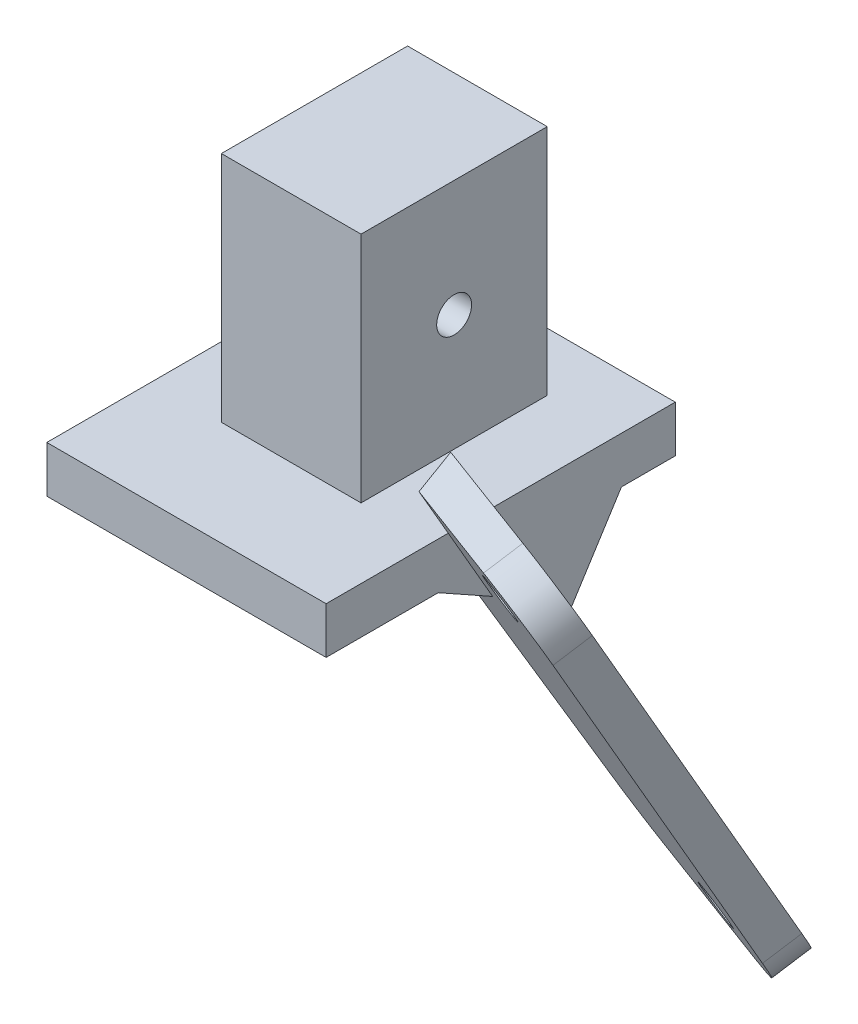
ISO-10303-21;
HEADER;
FILE_DESCRIPTION(('STEP AP214'),'2;1');
FILE_NAME('part.step','',(''),(''),'','','');
FILE_SCHEMA(('AUTOMOTIVE_DESIGN { 1 0 10303 214 1 1 1 1 }'));
ENDSEC;
DATA;
#1=APPLICATION_CONTEXT('core data for automotive mechanical design processes');
#2=APPLICATION_PROTOCOL_DEFINITION('international standard','automotive_design',2000,#1);
#3=PRODUCT_CONTEXT('',#1,'mechanical');
#4=PRODUCT('Part','Part','',(#3));
#5=PRODUCT_RELATED_PRODUCT_CATEGORY('part','',(#4));
#6=PRODUCT_DEFINITION_FORMATION('','',#4);
#7=PRODUCT_DEFINITION_CONTEXT('part definition',#1,'design');
#8=PRODUCT_DEFINITION('design','',#6,#7);
#9=PRODUCT_DEFINITION_SHAPE('','',#8);
#10=(LENGTH_UNIT() NAMED_UNIT(*) SI_UNIT(.MILLI.,.METRE.));
#11=(NAMED_UNIT(*) PLANE_ANGLE_UNIT() SI_UNIT($,.RADIAN.));
#12=(NAMED_UNIT(*) SI_UNIT($,.STERADIAN.) SOLID_ANGLE_UNIT());
#13=UNCERTAINTY_MEASURE_WITH_UNIT(LENGTH_MEASURE(1.E-05),#10,'distance_accuracy_value','');
#14=(GEOMETRIC_REPRESENTATION_CONTEXT(3) GLOBAL_UNCERTAINTY_ASSIGNED_CONTEXT((#13)) GLOBAL_UNIT_ASSIGNED_CONTEXT((#10,
#11,#12)) REPRESENTATION_CONTEXT('',''));
#15=CARTESIAN_POINT('',(0.,0.,0.));
#16=DIRECTION('',(0.,0.,1.));
#17=DIRECTION('',(1.,0.,0.));
#18=AXIS2_PLACEMENT_3D('',#15,#16,#17);
#19=CARTESIAN_POINT('',(0.,0.,0.));
#20=DIRECTION('',(0.,1.,0.));
#21=DIRECTION('',(0.,0.,1.));
#22=AXIS2_PLACEMENT_3D('',#19,#20,#21);
#23=PLANE('',#22);
#24=DIRECTION('',(0.,0.,-1.));
#25=VECTOR('',#24,1.);
#26=CARTESIAN_POINT('',(24.,0.,0.));
#27=LINE('',#26,#25);
#28=CARTESIAN_POINT('',(24.,0.,4.62668487913654));
#29=VERTEX_POINT('',#28);
#30=CARTESIAN_POINT('',(24.,0.,0.));
#31=VERTEX_POINT('',#30);
#32=EDGE_CURVE('E329',#29,#31,#27,.T.);
#33=ORIENTED_EDGE('',*,*,#32,.F.);
#34=DIRECTION('',(-0.939692620785907,0.,-0.342020143325673));
#35=VECTOR('',#34,1.);
#36=CARTESIAN_POINT('',(10.486715336839,0.,-0.291748505420117));
#37=LINE('',#36,#35);
#38=CARTESIAN_POINT('',(11.2882877676404,0.,0.));
#39=VERTEX_POINT('',#38);
#40=EDGE_CURVE('E520',#29,#39,#37,.T.);
#41=ORIENTED_EDGE('',*,*,#40,.T.);
#42=DIRECTION('',(-1.,0.,0.));
#43=VECTOR('',#42,1.);
#44=CARTESIAN_POINT('',(0.,0.,0.));
#45=LINE('',#44,#43);
#46=EDGE_CURVE('E321',#31,#39,#45,.T.);
#47=ORIENTED_EDGE('',*,*,#46,.F.);
#48=EDGE_LOOP('',(#33,#41,#47));
#49=FACE_BOUND('',#48,.T.);
#50=ADVANCED_FACE('F61',(#49),#23,.F.);
#51=CARTESIAN_POINT('',(24.9018797354497,9.78209952844714,19.5429186044547));
#52=DIRECTION('',(0.,-0.866025403784436,-0.500000000000004));
#53=DIRECTION('',(0.,0.500000000000004,-0.866025403784436));
#54=AXIS2_PLACEMENT_3D('',#51,#52,#53);
#55=PLANE('',#54);
#56=DIRECTION('',(0.953741925422946,-0.150313289241614,0.260350254019269));
#57=VECTOR('',#56,1.);
#58=CARTESIAN_POINT('',(24.,8.3514866403127,22.0208128126663));
#59=LINE('',#58,#57);
#60=CARTESIAN_POINT('',(24.,8.3514866403127,22.0208128126663));
#61=VERTEX_POINT('',#60);
#62=CARTESIAN_POINT('',(31.6299354033836,7.14898032637979,24.1036148448205));
#63=VERTEX_POINT('',#62);
#64=EDGE_CURVE('E263',#61,#63,#59,.T.);
#65=ORIENTED_EDGE('',*,*,#64,.T.);
#66=DIRECTION('',(-0.300626578483225,-0.476870962711477,0.825964736070553));
#67=VECTOR('',#66,1.);
#68=CARTESIAN_POINT('',(32.5318151388333,8.57959321451423,21.6257206366088));
#69=LINE('',#68,#67);
#70=CARTESIAN_POINT('',(32.5318151388333,8.57959321451423,21.6257206366088));
#71=VERTEX_POINT('',#70);
#72=EDGE_CURVE('E560',#63,#71,#69,.F.);
#73=ORIENTED_EDGE('',*,*,#72,.T.);
#74=DIRECTION('',(0.953741925422946,-0.150313289241614,0.260350254019269));
#75=VECTOR('',#74,1.);
#76=CARTESIAN_POINT('',(24.9018797354497,9.78209952844714,19.5429186044547));
#77=LINE('',#76,#75);
#78=CARTESIAN_POINT('',(24.,9.92423914286713,19.296725570511));
#79=VERTEX_POINT('',#78);
#80=EDGE_CURVE('E594',#79,#71,#77,.T.);
#81=ORIENTED_EDGE('',*,*,#80,.F.);
#82=DIRECTION('',(0.,0.500000000000004,-0.866025403784436));
#83=VECTOR('',#82,1.);
#84=CARTESIAN_POINT('',(24.,9.78209952844714,19.5429186044547));
#85=LINE('',#84,#83);
#86=EDGE_CURVE('E255',#61,#79,#85,.T.);
#87=ORIENTED_EDGE('',*,*,#86,.F.);
#88=EDGE_LOOP('',(#65,#73,#81,#87));
#89=FACE_BOUND('',#88,.T.);
#90=ADVANCED_FACE('F632',(#89),#55,.F.);
#91=CARTESIAN_POINT('',(-1.19973919209316,-1.9030944849345,3.29625633951065));
#92=DIRECTION('',(-0.300626578483225,-0.476870962711477,0.825964736070553));
#93=DIRECTION('',(0.,-0.866025403784436,-0.500000000000004));
#94=AXIS2_PLACEMENT_3D('',#91,#92,#93);
#95=PLANE('',#94);
#96=CARTESIAN_POINT('',(31.1012022506988,4.47493612945446,18.7351952555799));
#97=DIRECTION('',(-0.300626578483225,-0.476870962711477,0.825964736070553));
#98=DIRECTION('',(0.,-0.866025403784436,-0.500000000000004));
#99=AXIS2_PLACEMENT_3D('',#96,#97,#98);
#100=CIRCLE('',#99,1.8);
#101=CARTESIAN_POINT('',(31.1012022506988,2.91609040264248,17.8351952555799));
#102=VERTEX_POINT('',#101);
#103=EDGE_CURVE('E579',#102,#102,#100,.T.);
#104=ORIENTED_EDGE('',*,*,#103,.T.);
#105=EDGE_LOOP('',(#104));
#106=FACE_BOUND('',#105,.T.);
#107=CARTESIAN_POINT('',(31.1012022506988,-27.5680038105697,0.235195255579716));
#108=DIRECTION('',(-0.300626578483225,-0.476870962711477,0.825964736070553));
#109=DIRECTION('',(0.,-0.866025403784436,-0.500000000000004));
#110=AXIS2_PLACEMENT_3D('',#107,#108,#109);
#111=CIRCLE('',#110,1.8);
#112=CARTESIAN_POINT('',(31.1012022506988,-29.1268495373817,-0.664804744420289));
#113=VERTEX_POINT('',#112);
#114=EDGE_CURVE('E256',#113,#113,#111,.T.);
#115=ORIENTED_EDGE('',*,*,#114,.T.);
#116=EDGE_LOOP('',(#115));
#117=FACE_BOUND('',#116,.T.);
#118=CARTESIAN_POINT('',(12.3820748241734,-6.27508701730732,5.71546130331074));
#119=DIRECTION('',(-0.300626578483225,-0.476870962711477,0.825964736070553));
#120=DIRECTION('',(0.,-0.866025403784436,-0.500000000000004));
#121=AXIS2_PLACEMENT_3D('',#118,#119,#120);
#122=CIRCLE('',#121,5.);
#123=CARTESIAN_POINT('',(8.11681126769891,-7.53935722507935,3.43310558266799));
#124=VERTEX_POINT('',#123);
#125=CARTESIAN_POINT('',(8.04156708476999,-7.38435481355739,3.49520962379743));
#126=VERTEX_POINT('',#125);
#127=EDGE_CURVE('E549',#124,#126,#122,.F.);
#128=ORIENTED_EDGE('',*,*,#127,.T.);
#129=DIRECTION('',(0.939692620785907,0.,0.342020143325673));
#130=VECTOR('',#129,1.);
#131=CARTESIAN_POINT('',(25.3702172473642,-7.38435481355739,9.802322482994));
#132=LINE('',#131,#130);
#133=CARTESIAN_POINT('',(24.,-7.38435481355739,9.30360419047525));
#134=VERTEX_POINT('',#133);
#135=EDGE_CURVE('E340',#126,#134,#132,.T.);
#136=ORIENTED_EDGE('',*,*,#135,.T.);
#137=DIRECTION('',(0.,0.866025403784436,0.500000000000004));
#138=VECTOR('',#137,1.);
#139=CARTESIAN_POINT('',(24.,-2.87466749124288,11.9072733799746));
#140=LINE('',#139,#138);
#141=CARTESIAN_POINT('',(24.,4.,15.8763645066329));
#142=VERTEX_POINT('',#141);
#143=EDGE_CURVE('E270',#134,#142,#140,.T.);
#144=ORIENTED_EDGE('',*,*,#143,.T.);
#145=DIRECTION('',(0.,-0.866025403784436,-0.500000000000004));
#146=VECTOR('',#145,1.);
#147=CARTESIAN_POINT('',(24.,-5.87466749124286,10.1752225724057));
#148=LINE('',#147,#146);
#149=EDGE_CURVE('E254',#79,#142,#148,.T.);
#150=ORIENTED_EDGE('',*,*,#149,.F.);
#151=ORIENTED_EDGE('',*,*,#80,.T.);
#152=CARTESIAN_POINT('',(32.5318151388333,4.24946619559204,19.1257206366088));
#153=DIRECTION('',(-0.300626578483225,-0.476870962711477,0.825964736070553));
#154=DIRECTION('',(0.,-0.866025403784436,-0.500000000000004));
#155=AXIS2_PLACEMENT_3D('',#152,#153,#154);
#156=CIRCLE('',#155,5.);
#157=CARTESIAN_POINT('',(37.300524765948,3.49789974938397,20.4274719067051));
#158=VERTEX_POINT('',#157);
#159=EDGE_CURVE('E543',#71,#158,#156,.F.);
#160=ORIENTED_EDGE('',*,*,#159,.T.);
#161=DIRECTION('',(0.,-0.866025403784436,-0.500000000000004));
#162=VECTOR('',#161,1.);
#163=CARTESIAN_POINT('',(37.300524765948,7.82802676830616,22.9274719067051));
#164=LINE('',#163,#162);
#165=CARTESIAN_POINT('',(37.300524765948,-27.6790147868557,2.42747190670497));
#166=VERTEX_POINT('',#165);
#167=EDGE_CURVE('E276',#158,#166,#164,.T.);
#168=ORIENTED_EDGE('',*,*,#167,.T.);
#169=CARTESIAN_POINT('',(32.5318151388333,-26.9274483406477,1.12572063660863));
#170=DIRECTION('',(-0.300626578483225,-0.476870962711477,0.825964736070553));
#171=DIRECTION('',(0.,-0.866025403784436,-0.500000000000004));
#172=AXIS2_PLACEMENT_3D('',#169,#170,#171);
#173=CIRCLE('',#172,5.);
#174=CARTESIAN_POINT('',(32.5318151388333,-31.2575753595698,-1.37427936339139));
#175=VERTEX_POINT('',#174);
#176=EDGE_CURVE('E545',#166,#175,#173,.F.);
#177=ORIENTED_EDGE('',*,*,#176,.T.);
#178=DIRECTION('',(-0.953741925422947,0.150313289241614,-0.260350254019269));
#179=VECTOR('',#178,1.);
#180=CARTESIAN_POINT('',(37.300524765948,-32.0091418057779,-0.0725280932950497));
#181=LINE('',#180,#179);
#182=CARTESIAN_POINT('',(22.0054929341698,-29.5985876690598,-4.24773033248609));
#183=VERTEX_POINT('',#182);
#184=EDGE_CURVE('E271',#175,#183,#181,.T.);
#185=ORIENTED_EDGE('',*,*,#184,.T.);
#186=CARTESIAN_POINT('',(22.0054929341698,-25.2684606501376,-1.74773033248607));
#187=DIRECTION('',(-0.300626578483225,-0.476870962711477,0.825964736070553));
#188=DIRECTION('',(0.,-0.866025403784436,-0.500000000000004));
#189=AXIS2_PLACEMENT_3D('',#186,#187,#188);
#190=CIRCLE('',#189,5.);
#191=CARTESIAN_POINT('',(17.7402293776953,-26.5327308579097,-4.03008605312881));
#192=VERTEX_POINT('',#191);
#193=EDGE_CURVE('E547',#183,#192,#190,.F.);
#194=ORIENTED_EDGE('',*,*,#193,.T.);
#195=DIRECTION('',(-0.426526355647448,0.841818815774649,0.330781422310677));
#196=VECTOR('',#195,1.);
#197=CARTESIAN_POINT('',(4.4174632412376,-0.23809498526593,6.30203873442501));
#198=LINE('',#197,#196);
#199=EDGE_CURVE('E395',#192,#124,#198,.T.);
#200=ORIENTED_EDGE('',*,*,#199,.T.);
#201=EDGE_LOOP('',(#128,#136,#144,#150,#151,#160,#168,#177,#185,#194,#200));
#202=FACE_BOUND('',#201,.T.);
#203=ADVANCED_FACE('F566',(#106,#117,#202),#95,.F.);
#204=CARTESIAN_POINT('',(-2.10161892754284,-3.33370737306893,5.7741505477223));
#205=DIRECTION('',(-0.300626578483225,-0.476870962711477,0.825964736070553));
#206=DIRECTION('',(0.,-0.866025403784436,-0.500000000000004));
#207=AXIS2_PLACEMENT_3D('',#204,#205,#206);
#208=PLANE('',#207);
#209=DIRECTION('',(0.,0.866025403784436,0.500000000000004));
#210=VECTOR('',#209,1.);
#211=CARTESIAN_POINT('',(24.,-4.4474199937973,14.6313606221299));
#212=LINE('',#211,#210);
#213=CARTESIAN_POINT('',(24.,-2.61564518644261,15.6889363002509));
#214=VERTEX_POINT('',#213);
#215=CARTESIAN_POINT('',(24.,4.,19.5084808295067));
#216=VERTEX_POINT('',#215);
#217=EDGE_CURVE('E261',#214,#216,#212,.T.);
#218=ORIENTED_EDGE('',*,*,#217,.F.);
#219=DIRECTION('',(-0.939692620785907,0.,-0.342020143325673));
#220=VECTOR('',#219,1.);
#221=CARTESIAN_POINT('',(-2.23486024890906,-2.61564518644261,6.1402280695143));
#222=LINE('',#221,#220);
#223=CARTESIAN_POINT('',(3.72062588134553,-2.61564518644261,8.30784775151222));
#224=VERTEX_POINT('',#223);
#225=EDGE_CURVE('E81',#214,#224,#222,.T.);
#226=ORIENTED_EDGE('',*,*,#225,.T.);
#227=DIRECTION('',(-0.680788787401634,0.713808179397935,0.164330490088779));
#228=VECTOR('',#227,1.);
#229=CARTESIAN_POINT('',(5.16036488299063,-4.12521393168428,7.96031997179764));
#230=LINE('',#229,#228);
#231=CARTESIAN_POINT('',(6.71148546160899,-5.75156644620807,7.58590663011496));
#232=VERTEX_POINT('',#231);
#233=EDGE_CURVE('E73',#224,#232,#230,.F.);
#234=ORIENTED_EDGE('',*,*,#233,.T.);
#235=DIRECTION('',(0.,0.866025403784436,0.500000000000004));
#236=VECTOR('',#235,1.);
#237=CARTESIAN_POINT('',(6.71148546160899,11.0762210963497,17.3014342976767));
#238=LINE('',#237,#236);
#239=CARTESIAN_POINT('',(6.71148546160899,-6.95413345923368,6.89160424142605));
#240=VERTEX_POINT('',#239);
#241=EDGE_CURVE('E279',#240,#232,#238,.T.);
#242=ORIENTED_EDGE('',*,*,#241,.F.);
#243=CARTESIAN_POINT('',(11.4801950887237,-7.70569990544176,8.19335551152239));
#244=DIRECTION('',(-0.300626578483225,-0.476870962711477,0.825964736070553));
#245=DIRECTION('',(0.,-0.866025403784436,-0.500000000000004));
#246=AXIS2_PLACEMENT_3D('',#243,#244,#245);
#247=CIRCLE('',#246,5.);
#248=CARTESIAN_POINT('',(7.21493153224923,-8.96997011321379,5.91099979087965));
#249=VERTEX_POINT('',#248);
#250=EDGE_CURVE('E536',#240,#249,#247,.T.);
#251=ORIENTED_EDGE('',*,*,#250,.T.);
#252=DIRECTION('',(-0.426526355647448,0.841818815774649,0.330781422310677));
#253=VECTOR('',#252,1.);
#254=CARTESIAN_POINT('',(3.51558350578792,-1.66870787340036,8.77993294263667));
#255=LINE('',#254,#253);
#256=CARTESIAN_POINT('',(16.8383496422456,-27.9633437460441,-1.55219184491716));
#257=VERTEX_POINT('',#256);
#258=EDGE_CURVE('E578',#257,#249,#255,.T.);
#259=ORIENTED_EDGE('',*,*,#258,.F.);
#260=CARTESIAN_POINT('',(21.1036131987201,-26.6990735382721,0.730163875725593));
#261=DIRECTION('',(-0.300626578483225,-0.476870962711477,0.825964736070553));
#262=DIRECTION('',(0.,-0.866025403784436,-0.500000000000004));
#263=AXIS2_PLACEMENT_3D('',#260,#261,#262);
#264=CIRCLE('',#263,5.);
#265=CARTESIAN_POINT('',(21.1036131987201,-31.0292005571942,-1.76983612427443));
#266=VERTEX_POINT('',#265);
#267=EDGE_CURVE('E534',#257,#266,#264,.T.);
#268=ORIENTED_EDGE('',*,*,#267,.T.);
#269=DIRECTION('',(-0.953741925422946,0.150313289241614,-0.260350254019269));
#270=VECTOR('',#269,1.);
#271=CARTESIAN_POINT('',(6.71148546160899,-28.7609474777343,-5.69856570232354));
#272=LINE('',#271,#270);
#273=CARTESIAN_POINT('',(31.6299354033836,-32.6881882477043,1.10361484482027));
#274=VERTEX_POINT('',#273);
#275=EDGE_CURVE('E601',#274,#266,#272,.T.);
#276=ORIENTED_EDGE('',*,*,#275,.F.);
#277=CARTESIAN_POINT('',(31.6299354033836,-28.3580612287821,3.60361484482029));
#278=DIRECTION('',(-0.300626578483225,-0.476870962711477,0.825964736070553));
#279=DIRECTION('',(0.,-0.866025403784436,-0.500000000000004));
#280=AXIS2_PLACEMENT_3D('',#277,#278,#279);
#281=CIRCLE('',#280,5.);
#282=CARTESIAN_POINT('',(36.3986450304983,-29.1096276749902,4.90536611491663));
#283=VERTEX_POINT('',#282);
#284=EDGE_CURVE('E532',#274,#283,#281,.T.);
#285=ORIENTED_EDGE('',*,*,#284,.T.);
#286=DIRECTION('',(0.,-0.866025403784436,-0.500000000000004));
#287=VECTOR('',#286,1.);
#288=CARTESIAN_POINT('',(36.3986450304983,6.39741388017172,25.4053661149168));
#289=LINE('',#288,#287);
#290=CARTESIAN_POINT('',(36.3986450304983,2.06728686124954,22.9053661149168));
#291=VERTEX_POINT('',#290);
#292=EDGE_CURVE('E599',#291,#283,#289,.T.);
#293=ORIENTED_EDGE('',*,*,#292,.F.);
#294=CARTESIAN_POINT('',(31.6299354033836,2.81885330745761,21.6036148448204));
#295=DIRECTION('',(-0.300626578483225,-0.476870962711477,0.825964736070553));
#296=DIRECTION('',(0.,-0.866025403784436,-0.500000000000004));
#297=AXIS2_PLACEMENT_3D('',#294,#295,#296);
#298=CIRCLE('',#297,5.);
#299=EDGE_CURVE('E527',#291,#63,#298,.T.);
#300=ORIENTED_EDGE('',*,*,#299,.T.);
#301=ORIENTED_EDGE('',*,*,#64,.F.);
#302=DIRECTION('',(0.,-0.866025403784436,-0.500000000000004));
#303=VECTOR('',#302,1.);
#304=CARTESIAN_POINT('',(24.,-7.44741999379728,12.899309814561));
#305=LINE('',#304,#303);
#306=EDGE_CURVE('E251',#61,#216,#305,.T.);
#307=ORIENTED_EDGE('',*,*,#306,.T.);
#308=EDGE_LOOP('',(#218,#226,#234,#242,#251,#259,#268,#276,#285,#293,#300,#301,#307));
#309=FACE_BOUND('',#308,.T.);
#310=CARTESIAN_POINT('',(30.1993225152492,3.04432324132003,21.2130894637915));
#311=DIRECTION('',(-0.300626578483225,-0.476870962711477,0.825964736070553));
#312=DIRECTION('',(0.,-0.866025403784436,-0.500000000000004));
#313=AXIS2_PLACEMENT_3D('',#310,#311,#312);
#314=CIRCLE('',#313,1.8);
#315=CARTESIAN_POINT('',(30.1993225152492,1.48547751450805,20.3130894637915));
#316=VERTEX_POINT('',#315);
#317=EDGE_CURVE('E582',#316,#316,#314,.T.);
#318=ORIENTED_EDGE('',*,*,#317,.F.);
#319=EDGE_LOOP('',(#318));
#320=FACE_BOUND('',#319,.T.);
#321=CARTESIAN_POINT('',(30.1993225152491,-28.9986166987041,2.71308946379138));
#322=DIRECTION('',(-0.300626578483225,-0.476870962711477,0.825964736070553));
#323=DIRECTION('',(0.,-0.866025403784436,-0.500000000000004));
#324=AXIS2_PLACEMENT_3D('',#321,#322,#323);
#325=CIRCLE('',#324,1.8);
#326=CARTESIAN_POINT('',(30.1993225152491,-30.5574624255161,1.81308946379137));
#327=VERTEX_POINT('',#326);
#328=EDGE_CURVE('E589',#327,#327,#325,.T.);
#329=ORIENTED_EDGE('',*,*,#328,.F.);
#330=EDGE_LOOP('',(#329));
#331=FACE_BOUND('',#330,.T.);
#332=ADVANCED_FACE('F259',(#309,#320,#331),#208,.T.);
#333=CARTESIAN_POINT('',(24.,4.,0.));
#334=DIRECTION('',(-1.,0.,0.));
#335=DIRECTION('',(0.,0.,1.));
#336=AXIS2_PLACEMENT_3D('',#333,#334,#335);
#337=PLANE('',#336);
#338=ORIENTED_EDGE('',*,*,#143,.F.);
#339=DIRECTION('',(0.,-0.84481073593832,0.535065248771918));
#340=VECTOR('',#339,1.);
#341=CARTESIAN_POINT('',(24.,4.94621584021188,1.49397349605606));
#342=LINE('',#341,#340);
#343=EDGE_CURVE('E389',#134,#29,#342,.F.);
#344=ORIENTED_EDGE('',*,*,#343,.T.);
#345=ORIENTED_EDGE('',*,*,#32,.T.);
#346=DIRECTION('',(0.,-1.,0.));
#347=VECTOR('',#346,1.);
#348=CARTESIAN_POINT('',(24.,4.,0.));
#349=LINE('',#348,#347);
#350=CARTESIAN_POINT('',(24.,4.,0.));
#351=VERTEX_POINT('',#350);
#352=EDGE_CURVE('E703',#351,#31,#349,.T.);
#353=ORIENTED_EDGE('',*,*,#352,.F.);
#354=DIRECTION('',(0.,0.,-1.));
#355=VECTOR('',#354,1.);
#356=CARTESIAN_POINT('',(24.,4.,0.));
#357=LINE('',#356,#355);
#358=EDGE_CURVE('E246',#142,#351,#357,.T.);
#359=ORIENTED_EDGE('',*,*,#358,.F.);
#360=EDGE_LOOP('',(#338,#344,#345,#353,#359));
#361=FACE_BOUND('',#360,.T.);
#362=ADVANCED_FACE('F511',(#361),#337,.F.);
#363=CARTESIAN_POINT('',(0.,4.,0.));
#364=DIRECTION('',(0.,1.,0.));
#365=DIRECTION('',(0.,0.,1.));
#366=AXIS2_PLACEMENT_3D('',#363,#364,#365);
#367=PLANE('',#366);
#368=DIRECTION('',(0.,0.,-1.));
#369=VECTOR('',#368,1.);
#370=CARTESIAN_POINT('',(18.,4.,5.));
#371=LINE('',#370,#369);
#372=CARTESIAN_POINT('',(18.,4.,21.));
#373=VERTEX_POINT('',#372);
#374=CARTESIAN_POINT('',(18.,4.,5.));
#375=VERTEX_POINT('',#374);
#376=EDGE_CURVE('E304',#373,#375,#371,.T.);
#377=ORIENTED_EDGE('',*,*,#376,.F.);
#378=DIRECTION('',(1.,0.,0.));
#379=VECTOR('',#378,1.);
#380=CARTESIAN_POINT('',(6.00000000000001,4.,21.));
#381=LINE('',#380,#379);
#382=CARTESIAN_POINT('',(6.00000000000001,4.,21.));
#383=VERTEX_POINT('',#382);
#384=EDGE_CURVE('E301',#383,#373,#381,.T.);
#385=ORIENTED_EDGE('',*,*,#384,.F.);
#386=DIRECTION('',(0.,0.,1.));
#387=VECTOR('',#386,1.);
#388=CARTESIAN_POINT('',(6.00000000000001,4.,5.));
#389=LINE('',#388,#387);
#390=CARTESIAN_POINT('',(6.00000000000001,4.,5.));
#391=VERTEX_POINT('',#390);
#392=EDGE_CURVE('E285',#391,#383,#389,.T.);
#393=ORIENTED_EDGE('',*,*,#392,.F.);
#394=DIRECTION('',(-1.,0.,0.));
#395=VECTOR('',#394,1.);
#396=CARTESIAN_POINT('',(6.00000000000001,4.,5.));
#397=LINE('',#396,#395);
#398=EDGE_CURVE('E292',#375,#391,#397,.T.);
#399=ORIENTED_EDGE('',*,*,#398,.F.);
#400=EDGE_LOOP('',(#377,#385,#393,#399));
#401=FACE_BOUND('',#400,.T.);
#402=ORIENTED_EDGE('',*,*,#358,.T.);
#403=DIRECTION('',(-1.,0.,0.));
#404=VECTOR('',#403,1.);
#405=CARTESIAN_POINT('',(0.,4.,0.));
#406=LINE('',#405,#404);
#407=CARTESIAN_POINT('',(0.,4.,0.));
#408=VERTEX_POINT('',#407);
#409=EDGE_CURVE('E245',#351,#408,#406,.T.);
#410=ORIENTED_EDGE('',*,*,#409,.T.);
#411=DIRECTION('',(0.,0.,1.));
#412=VECTOR('',#411,1.);
#413=CARTESIAN_POINT('',(0.,4.,0.));
#414=LINE('',#413,#412);
#415=CARTESIAN_POINT('',(0.,4.,30.));
#416=VERTEX_POINT('',#415);
#417=EDGE_CURVE('E319',#408,#416,#414,.T.);
#418=ORIENTED_EDGE('',*,*,#417,.T.);
#419=DIRECTION('',(1.,0.,0.));
#420=VECTOR('',#419,1.);
#421=CARTESIAN_POINT('',(0.,4.,30.));
#422=LINE('',#421,#420);
#423=CARTESIAN_POINT('',(24.,4.,30.));
#424=VERTEX_POINT('',#423);
#425=EDGE_CURVE('E240',#416,#424,#422,.T.);
#426=ORIENTED_EDGE('',*,*,#425,.T.);
#427=EDGE_CURVE('E234',#424,#216,#357,.T.);
#428=ORIENTED_EDGE('',*,*,#427,.T.);
#429=DIRECTION('',(0.,0.,-1.));
#430=VECTOR('',#429,1.);
#431=CARTESIAN_POINT('',(24.,4.,23.5414123331734));
#432=LINE('',#431,#430);
#433=EDGE_CURVE('E237',#216,#142,#432,.T.);
#434=ORIENTED_EDGE('',*,*,#433,.T.);
#435=EDGE_LOOP('',(#402,#410,#418,#426,#428,#434));
#436=FACE_BOUND('',#435,.T.);
#437=ADVANCED_FACE('F236',(#401,#436),#367,.T.);
#438=CARTESIAN_POINT('',(3.82069132181488,0.,0.));
#439=VERTEX_POINT('',#438);
#440=CARTESIAN_POINT('',(0.,0.,0.));
#441=VERTEX_POINT('',#440);
#442=EDGE_CURVE('E332',#439,#441,#45,.T.);
#443=ORIENTED_EDGE('',*,*,#442,.F.);
#444=CARTESIAN_POINT('',(2.70089204368231,0.,3.50694580526302));
#445=CARTESIAN_POINT('',(3.27079630282216,0.,1.41812239966285));
#446=CARTESIAN_POINT('',(4.01382894624458,0.,-0.670319460041967));
#447=CARTESIAN_POINT('',(4.89402018745804,0.,-2.65727949453189));
#448=B_SPLINE_CURVE_WITH_KNOTS('',3,(#444,#445,#446,#447),.UNSPECIFIED.,.F.,.F.,(4,4),
(4.57093154388576,4.88424373170343),.UNSPECIFIED.);
#449=CARTESIAN_POINT('',(2.70089204368231,0.,3.50694580526302));
#450=VERTEX_POINT('',#449);
#451=EDGE_CURVE('E349',#439,#450,#448,.F.);
#452=ORIENTED_EDGE('',*,*,#451,.T.);
#453=DIRECTION('',(-0.263342239326904,0.,0.964702474852372));
#454=VECTOR('',#453,1.);
#455=CARTESIAN_POINT('',(1.09917027915965,0.,9.37453831229634));
#456=LINE('',#455,#454);
#457=CARTESIAN_POINT('',(0.439642942078132,0.,11.7905869338223));
#458=VERTEX_POINT('',#457);
#459=EDGE_CURVE('E344',#450,#458,#456,.T.);
#460=ORIENTED_EDGE('',*,*,#459,.T.);
#461=DIRECTION('',(0.939692620785907,0.,0.342020143325673));
#462=VECTOR('',#461,1.);
#463=CARTESIAN_POINT('',(-3.73799314132519,0.,10.2700517498671));
#464=LINE('',#463,#462);
#465=CARTESIAN_POINT('',(24.,0.,20.3658556115896));
#466=VERTEX_POINT('',#465);
#467=EDGE_CURVE('E342',#458,#466,#464,.T.);
#468=ORIENTED_EDGE('',*,*,#467,.T.);
#469=CARTESIAN_POINT('',(24.,0.,30.));
#470=VERTEX_POINT('',#469);
#471=EDGE_CURVE('E330',#470,#466,#27,.T.);
#472=ORIENTED_EDGE('',*,*,#471,.F.);
#473=DIRECTION('',(1.,0.,0.));
#474=VECTOR('',#473,1.);
#475=CARTESIAN_POINT('',(0.,0.,30.));
#476=LINE('',#475,#474);
#477=CARTESIAN_POINT('',(0.,0.,30.));
#478=VERTEX_POINT('',#477);
#479=EDGE_CURVE('E327',#478,#470,#476,.T.);
#480=ORIENTED_EDGE('',*,*,#479,.F.);
#481=DIRECTION('',(0.,0.,1.));
#482=VECTOR('',#481,1.);
#483=CARTESIAN_POINT('',(0.,0.,0.));
#484=LINE('',#483,#482);
#485=EDGE_CURVE('E318',#441,#478,#484,.T.);
#486=ORIENTED_EDGE('',*,*,#485,.F.);
#487=EDGE_LOOP('',(#443,#452,#460,#468,#472,#480,#486));
#488=FACE_BOUND('',#487,.T.);
#489=ADVANCED_FACE('F356',(#488),#23,.F.);
#490=CARTESIAN_POINT('',(18.,24.,5.));
#491=DIRECTION('',(-1.,0.,0.));
#492=DIRECTION('',(0.,0.,1.));
#493=AXIS2_PLACEMENT_3D('',#490,#491,#492);
#494=PLANE('',#493);
#495=CARTESIAN_POINT('',(18.,14.,13.));
#496=DIRECTION('',(1.,0.,0.));
#497=DIRECTION('',(0.,0.,-1.));
#498=AXIS2_PLACEMENT_3D('',#495,#496,#497);
#499=CIRCLE('',#498,1.5);
#500=CARTESIAN_POINT('',(18.,14.,11.5));
#501=VERTEX_POINT('',#500);
#502=EDGE_CURVE('E273',#501,#501,#499,.T.);
#503=ORIENTED_EDGE('',*,*,#502,.F.);
#504=EDGE_LOOP('',(#503));
#505=FACE_BOUND('',#504,.T.);
#506=ORIENTED_EDGE('',*,*,#376,.T.);
#507=DIRECTION('',(0.,-1.,0.));
#508=VECTOR('',#507,1.);
#509=CARTESIAN_POINT('',(18.,24.,5.));
#510=LINE('',#509,#508);
#511=CARTESIAN_POINT('',(18.,24.,5.));
#512=VERTEX_POINT('',#511);
#513=EDGE_CURVE('E310',#512,#375,#510,.T.);
#514=ORIENTED_EDGE('',*,*,#513,.F.);
#515=DIRECTION('',(0.,0.,-1.));
#516=VECTOR('',#515,1.);
#517=CARTESIAN_POINT('',(18.,24.,5.));
#518=LINE('',#517,#516);
#519=CARTESIAN_POINT('',(18.,24.,21.));
#520=VERTEX_POINT('',#519);
#521=EDGE_CURVE('E294',#520,#512,#518,.T.);
#522=ORIENTED_EDGE('',*,*,#521,.F.);
#523=DIRECTION('',(0.,-1.,0.));
#524=VECTOR('',#523,1.);
#525=CARTESIAN_POINT('',(18.,24.,21.));
#526=LINE('',#525,#524);
#527=EDGE_CURVE('E313',#520,#373,#526,.T.);
#528=ORIENTED_EDGE('',*,*,#527,.T.);
#529=EDGE_LOOP('',(#506,#514,#522,#528));
#530=FACE_BOUND('',#529,.T.);
#531=ADVANCED_FACE('F366',(#505,#530),#494,.F.);
#532=CARTESIAN_POINT('',(0.,4.,0.));
#533=DIRECTION('',(1.,0.,0.));
#534=DIRECTION('',(0.,0.,-1.));
#535=AXIS2_PLACEMENT_3D('',#532,#533,#534);
#536=PLANE('',#535);
#537=ORIENTED_EDGE('',*,*,#485,.T.);
#538=DIRECTION('',(0.,-1.,0.));
#539=VECTOR('',#538,1.);
#540=CARTESIAN_POINT('',(0.,4.,30.));
#541=LINE('',#540,#539);
#542=EDGE_CURVE('E265',#416,#478,#541,.T.);
#543=ORIENTED_EDGE('',*,*,#542,.F.);
#544=ORIENTED_EDGE('',*,*,#417,.F.);
#545=DIRECTION('',(0.,-1.,0.));
#546=VECTOR('',#545,1.);
#547=CARTESIAN_POINT('',(0.,4.,0.));
#548=LINE('',#547,#546);
#549=EDGE_CURVE('E324',#408,#441,#548,.T.);
#550=ORIENTED_EDGE('',*,*,#549,.T.);
#551=EDGE_LOOP('',(#537,#543,#544,#550));
#552=FACE_BOUND('',#551,.T.);
#553=ADVANCED_FACE('F493',(#552),#536,.F.);
#554=CARTESIAN_POINT('',(0.,4.,30.));
#555=DIRECTION('',(0.,0.,-1.));
#556=DIRECTION('',(-1.,0.,0.));
#557=AXIS2_PLACEMENT_3D('',#554,#555,#556);
#558=PLANE('',#557);
#559=ORIENTED_EDGE('',*,*,#479,.T.);
#560=DIRECTION('',(0.,-1.,0.));
#561=VECTOR('',#560,1.);
#562=CARTESIAN_POINT('',(24.,4.,30.));
#563=LINE('',#562,#561);
#564=EDGE_CURVE('E700',#424,#470,#563,.T.);
#565=ORIENTED_EDGE('',*,*,#564,.F.);
#566=ORIENTED_EDGE('',*,*,#425,.F.);
#567=ORIENTED_EDGE('',*,*,#542,.T.);
#568=EDGE_LOOP('',(#559,#565,#566,#567));
#569=FACE_BOUND('',#568,.T.);
#570=ADVANCED_FACE('F690',(#569),#558,.F.);
#571=ORIENTED_EDGE('',*,*,#471,.T.);
#572=DIRECTION('',(0.,-0.488116069350405,-0.872778725016777));
#573=VECTOR('',#572,1.);
#574=CARTESIAN_POINT('',(24.,-7.72317805212531,6.55638299500066));
#575=LINE('',#574,#573);
#576=EDGE_CURVE('E13',#466,#214,#575,.T.);
#577=ORIENTED_EDGE('',*,*,#576,.T.);
#578=ORIENTED_EDGE('',*,*,#217,.T.);
#579=ORIENTED_EDGE('',*,*,#427,.F.);
#580=ORIENTED_EDGE('',*,*,#564,.T.);
#581=EDGE_LOOP('',(#571,#577,#578,#579,#580));
#582=FACE_BOUND('',#581,.T.);
#583=ADVANCED_FACE('F268',(#582),#337,.F.);
#584=CARTESIAN_POINT('',(0.,4.,0.));
#585=DIRECTION('',(0.,0.,1.));
#586=DIRECTION('',(1.,0.,0.));
#587=AXIS2_PLACEMENT_3D('',#584,#585,#586);
#588=PLANE('',#587);
#589=ORIENTED_EDGE('',*,*,#46,.T.);
#590=DIRECTION('',(0.867029906258276,0.498256100468188,0.));
#591=VECTOR('',#590,1.);
#592=CARTESIAN_POINT('',(4.53043239226129,-3.88353693749215,0.));
#593=LINE('',#592,#591);
#594=CARTESIAN_POINT('',(6.75041122688828,-2.60778163853519,0.));
#595=VERTEX_POINT('',#594);
#596=EDGE_CURVE('E381',#39,#595,#593,.F.);
#597=ORIENTED_EDGE('',*,*,#596,.T.);
#598=CARTESIAN_POINT('',(3.82069132181467,0.,0.));
#599=CARTESIAN_POINT('',(3.94526040446976,-0.116515844584746,-2.85713381097429E-08));
#600=CARTESIAN_POINT('',(4.07017364466965,-0.232664068438034,-5.23772311360385E-07));
#601=CARTESIAN_POINT('',(4.31921827633043,-0.462820342376104,-1.89440683671371E-06));
#602=CARTESIAN_POINT('',(4.44334132198181,-0.576837423906528,-2.76525250803213E-06));
#603=CARTESIAN_POINT('',(4.69079462815453,-0.802727105954399,-4.35093492849828E-06));
#604=CARTESIAN_POINT('',(4.81411641250837,-0.914608990186521,-5.06752552006209E-06));
#605=CARTESIAN_POINT('',(5.05995619755419,-1.13622391529595,-6.05286731526203E-06));
#606=CARTESIAN_POINT('',(5.18246559031736,-1.24596650399289,-6.32698697385845E-06));
#607=CARTESIAN_POINT('',(5.42666930924843,-1.4632989812427,-6.32360196576936E-06));
#608=CARTESIAN_POINT('',(5.54835489710783,-1.57089868718561,-6.05289727428703E-06));
#609=CARTESIAN_POINT('',(5.79089951759188,-1.78394186113436,-5.0640544054162E-06));
#610=CARTESIAN_POINT('',(5.91174968210769,-1.88939542413768,-4.3515895397889E-06));
#611=CARTESIAN_POINT('',(6.15261168665314,-2.09814331682844,-2.76423012082665E-06));
#612=CARTESIAN_POINT('',(6.27261453045539,-2.20144802467374,-1.89152551582587E-06));
#613=CARTESIAN_POINT('',(6.5117700823799,-2.40589508868888,-5.33396422806928E-07));
#614=CARTESIAN_POINT('',(6.63091366495885,-2.50704812057528,-4.31013935402603E-08));
#615=CARTESIAN_POINT('',(6.75041122688828,-2.60778163853519,0.));
#616=B_SPLINE_CURVE_WITH_KNOTS('',3,(#598,#599,#600,#601,#602,#603,#604,#605,#606,#607,#608,
#609,#610,#611,#612,#613,#614,#615),.UNSPECIFIED.,.F.,.F.,(4,2,2,2,2,2,2,2,4),(0.,
0.511703188055693,1.01732626158268,1.51685513953744,2.01027644887016,2.49757753877867,
2.97874649530477,3.45377215629268,3.9226441267314),.UNSPECIFIED.);
#617=EDGE_CURVE('E470',#595,#439,#616,.F.);
#618=ORIENTED_EDGE('',*,*,#617,.T.);
#619=ORIENTED_EDGE('',*,*,#442,.T.);
#620=ORIENTED_EDGE('',*,*,#549,.F.);
#621=ORIENTED_EDGE('',*,*,#409,.F.);
#622=ORIENTED_EDGE('',*,*,#352,.T.);
#623=EDGE_LOOP('',(#589,#597,#618,#619,#620,#621,#622));
#624=FACE_BOUND('',#623,.T.);
#625=ADVANCED_FACE('F368',(#624),#588,.F.);
#626=CARTESIAN_POINT('',(6.00000000000001,24.,5.));
#627=DIRECTION('',(1.,0.,0.));
#628=DIRECTION('',(0.,0.,-1.));
#629=AXIS2_PLACEMENT_3D('',#626,#627,#628);
#630=PLANE('',#629);
#631=CARTESIAN_POINT('',(5.99999999999999,14.,13.));
#632=DIRECTION('',(1.,0.,0.));
#633=DIRECTION('',(0.,0.,-1.));
#634=AXIS2_PLACEMENT_3D('',#631,#632,#633);
#635=CIRCLE('',#634,1.5);
#636=CARTESIAN_POINT('',(5.99999999999999,14.,11.5));
#637=VERTEX_POINT('',#636);
#638=EDGE_CURVE('E282',#637,#637,#635,.T.);
#639=ORIENTED_EDGE('',*,*,#638,.T.);
#640=EDGE_LOOP('',(#639));
#641=FACE_BOUND('',#640,.T.);
#642=ORIENTED_EDGE('',*,*,#392,.T.);
#643=DIRECTION('',(0.,-1.,0.));
#644=VECTOR('',#643,1.);
#645=CARTESIAN_POINT('',(6.00000000000001,24.,21.));
#646=LINE('',#645,#644);
#647=CARTESIAN_POINT('',(6.00000000000001,24.,21.));
#648=VERTEX_POINT('',#647);
#649=EDGE_CURVE('E315',#648,#383,#646,.T.);
#650=ORIENTED_EDGE('',*,*,#649,.F.);
#651=DIRECTION('',(0.,0.,1.));
#652=VECTOR('',#651,1.);
#653=CARTESIAN_POINT('',(6.00000000000001,24.,5.));
#654=LINE('',#653,#652);
#655=CARTESIAN_POINT('',(6.00000000000001,24.,5.));
#656=VERTEX_POINT('',#655);
#657=EDGE_CURVE('E288',#656,#648,#654,.T.);
#658=ORIENTED_EDGE('',*,*,#657,.F.);
#659=DIRECTION('',(0.,-1.,0.));
#660=VECTOR('',#659,1.);
#661=CARTESIAN_POINT('',(6.00000000000001,24.,5.));
#662=LINE('',#661,#660);
#663=EDGE_CURVE('E298',#656,#391,#662,.T.);
#664=ORIENTED_EDGE('',*,*,#663,.T.);
#665=EDGE_LOOP('',(#642,#650,#658,#664));
#666=FACE_BOUND('',#665,.T.);
#667=ADVANCED_FACE('F372',(#641,#666),#630,.F.);
#668=CARTESIAN_POINT('',(6.00000000000001,24.,21.));
#669=DIRECTION('',(0.,0.,-1.));
#670=DIRECTION('',(-1.,0.,0.));
#671=AXIS2_PLACEMENT_3D('',#668,#669,#670);
#672=PLANE('',#671);
#673=ORIENTED_EDGE('',*,*,#384,.T.);
#674=ORIENTED_EDGE('',*,*,#527,.F.);
#675=DIRECTION('',(1.,0.,0.));
#676=VECTOR('',#675,1.);
#677=CARTESIAN_POINT('',(6.00000000000001,24.,21.));
#678=LINE('',#677,#676);
#679=EDGE_CURVE('E291',#648,#520,#678,.T.);
#680=ORIENTED_EDGE('',*,*,#679,.F.);
#681=ORIENTED_EDGE('',*,*,#649,.T.);
#682=EDGE_LOOP('',(#673,#674,#680,#681));
#683=FACE_BOUND('',#682,.T.);
#684=ADVANCED_FACE('F657',(#683),#672,.F.);
#685=CARTESIAN_POINT('',(6.00000000000001,24.,5.));
#686=DIRECTION('',(0.,0.,1.));
#687=DIRECTION('',(1.,0.,0.));
#688=AXIS2_PLACEMENT_3D('',#685,#686,#687);
#689=PLANE('',#688);
#690=ORIENTED_EDGE('',*,*,#398,.T.);
#691=ORIENTED_EDGE('',*,*,#663,.F.);
#692=DIRECTION('',(-1.,0.,0.));
#693=VECTOR('',#692,1.);
#694=CARTESIAN_POINT('',(6.00000000000001,24.,5.));
#695=LINE('',#694,#693);
#696=EDGE_CURVE('E296',#512,#656,#695,.T.);
#697=ORIENTED_EDGE('',*,*,#696,.F.);
#698=ORIENTED_EDGE('',*,*,#513,.T.);
#699=EDGE_LOOP('',(#690,#691,#697,#698));
#700=FACE_BOUND('',#699,.T.);
#701=ADVANCED_FACE('F653',(#700),#689,.F.);
#702=CARTESIAN_POINT('',(0.,24.,0.));
#703=DIRECTION('',(0.,1.,0.));
#704=DIRECTION('',(0.,0.,1.));
#705=AXIS2_PLACEMENT_3D('',#702,#703,#704);
#706=PLANE('',#705);
#707=ORIENTED_EDGE('',*,*,#657,.T.);
#708=ORIENTED_EDGE('',*,*,#679,.T.);
#709=ORIENTED_EDGE('',*,*,#521,.T.);
#710=ORIENTED_EDGE('',*,*,#696,.T.);
#711=EDGE_LOOP('',(#707,#708,#709,#710));
#712=FACE_BOUND('',#711,.T.);
#713=ADVANCED_FACE('F649',(#712),#706,.T.);
#714=CARTESIAN_POINT('',(5.99999999999999,14.,13.));
#715=DIRECTION('',(1.,0.,0.));
#716=DIRECTION('',(0.,0.,-1.));
#717=AXIS2_PLACEMENT_3D('',#714,#715,#716);
#718=CYLINDRICAL_SURFACE('',#717,1.5);
#719=ORIENTED_EDGE('',*,*,#638,.F.);
#720=EDGE_LOOP('',(#719));
#721=FACE_BOUND('',#720,.T.);
#722=ORIENTED_EDGE('',*,*,#502,.T.);
#723=EDGE_LOOP('',(#722));
#724=FACE_BOUND('',#723,.T.);
#725=ADVANCED_FACE('F646',(#721,#724),#718,.F.);
#726=CARTESIAN_POINT('',(7.61336519705867,12.5068339844842,14.823540089465));
#727=DIRECTION('',(0.953741925422946,-0.150313289241614,0.260350254019269));
#728=DIRECTION('',(0.263342239326904,0.,-0.964702474852372));
#729=AXIS2_PLACEMENT_3D('',#726,#727,#728);
#730=PLANE('',#729);
#731=ORIENTED_EDGE('',*,*,#241,.T.);
#732=DIRECTION('',(0.263342239326904,0.,-0.964702474852372));
#733=VECTOR('',#732,1.);
#734=CARTESIAN_POINT('',(6.76975964172406,-5.75156644620807,7.37243063811046));
#735=LINE('',#734,#733);
#736=CARTESIAN_POINT('',(7.46960167079705,-5.75156644620807,4.80869707535936));
#737=VERTEX_POINT('',#736);
#738=EDGE_CURVE('E521',#232,#737,#735,.T.);
#739=ORIENTED_EDGE('',*,*,#738,.T.);
#740=DIRECTION('',(-0.300626578483225,-0.476870962711477,0.825964736070553));
#741=VECTOR('',#740,1.);
#742=CARTESIAN_POINT('',(7.61336519705867,-5.52352057109926,4.41371003321439));
#743=LINE('',#742,#741);
#744=EDGE_CURVE('E264',#737,#240,#743,.T.);
#745=ORIENTED_EDGE('',*,*,#744,.T.);
#746=EDGE_LOOP('',(#731,#739,#745));
#747=FACE_BOUND('',#746,.T.);
#748=ADVANCED_FACE('F609',(#747),#730,.F.);
#749=CARTESIAN_POINT('',(37.300524765948,7.82802676830616,22.9274719067051));
#750=DIRECTION('',(-0.953741925422946,0.150313289241614,-0.260350254019269));
#751=DIRECTION('',(-0.263342239326904,0.,0.964702474852372));
#752=AXIS2_PLACEMENT_3D('',#749,#750,#751);
#753=PLANE('',#752);
#754=ORIENTED_EDGE('',*,*,#292,.T.);
#755=DIRECTION('',(-0.300626578483225,-0.476870962711477,0.825964736070553));
#756=VECTOR('',#755,1.);
#757=CARTESIAN_POINT('',(37.300524765948,-27.6790147868557,2.42747190670497));
#758=LINE('',#757,#756);
#759=EDGE_CURVE('E559',#283,#166,#758,.F.);
#760=ORIENTED_EDGE('',*,*,#759,.T.);
#761=ORIENTED_EDGE('',*,*,#167,.F.);
#762=DIRECTION('',(-0.300626578483225,-0.476870962711477,0.825964736070553));
#763=VECTOR('',#762,1.);
#764=CARTESIAN_POINT('',(37.300524765948,3.49789974938397,20.4274719067051));
#765=LINE('',#764,#763);
#766=EDGE_CURVE('E556',#158,#291,#765,.T.);
#767=ORIENTED_EDGE('',*,*,#766,.T.);
#768=EDGE_LOOP('',(#754,#760,#761,#767));
#769=FACE_BOUND('',#768,.T.);
#770=ADVANCED_FACE('F644',(#769),#753,.F.);
#771=CARTESIAN_POINT('',(7.61336519705866,-27.3303345895999,-8.1764599105352));
#772=DIRECTION('',(0.,0.866025403784436,0.500000000000004));
#773=DIRECTION('',(0.,-0.500000000000004,0.866025403784436));
#774=AXIS2_PLACEMENT_3D('',#771,#772,#773);
#775=PLANE('',#774);
#776=ORIENTED_EDGE('',*,*,#275,.T.);
#777=DIRECTION('',(-0.300626578483225,-0.476870962711477,0.825964736070553));
#778=VECTOR('',#777,1.);
#779=CARTESIAN_POINT('',(22.0054929341698,-29.5985876690598,-4.24773033248609));
#780=LINE('',#779,#778);
#781=EDGE_CURVE('E554',#266,#183,#780,.F.);
#782=ORIENTED_EDGE('',*,*,#781,.T.);
#783=ORIENTED_EDGE('',*,*,#184,.F.);
#784=DIRECTION('',(-0.300626578483225,-0.476870962711477,0.825964736070553));
#785=VECTOR('',#784,1.);
#786=CARTESIAN_POINT('',(32.5318151388333,-31.2575753595698,-1.37427936339139));
#787=LINE('',#786,#785);
#788=EDGE_CURVE('E551',#175,#274,#787,.T.);
#789=ORIENTED_EDGE('',*,*,#788,.T.);
#790=EDGE_LOOP('',(#776,#782,#783,#789));
#791=FACE_BOUND('',#790,.T.);
#792=ADVANCED_FACE('F824',(#791),#775,.F.);
#793=CARTESIAN_POINT('',(24.,14.,23.5414123331734));
#794=DIRECTION('',(-1.,0.,0.));
#795=DIRECTION('',(0.,0.,1.));
#796=AXIS2_PLACEMENT_3D('',#793,#794,#795);
#797=PLANE('',#796);
#798=ORIENTED_EDGE('',*,*,#149,.T.);
#799=ORIENTED_EDGE('',*,*,#433,.F.);
#800=ORIENTED_EDGE('',*,*,#306,.F.);
#801=ORIENTED_EDGE('',*,*,#86,.T.);
#802=EDGE_LOOP('',(#798,#799,#800,#801));
#803=FACE_BOUND('',#802,.T.);
#804=ADVANCED_FACE('F250',(#803),#797,.T.);
#805=CARTESIAN_POINT('',(4.4174632412376,-0.23809498526593,6.30203873442501));
#806=DIRECTION('',(0.853052711294897,0.252854041554406,0.45647114412855));
#807=DIRECTION('',(0.471802636914221,0.,-0.881704186108236));
#808=AXIS2_PLACEMENT_3D('',#805,#806,#807);
#809=PLANE('',#808);
#810=ORIENTED_EDGE('',*,*,#258,.T.);
#811=DIRECTION('',(-0.300626578483225,-0.476870962711477,0.825964736070553));
#812=VECTOR('',#811,1.);
#813=CARTESIAN_POINT('',(8.11681126769891,-7.53935722507936,3.43310558266799));
#814=LINE('',#813,#812);
#815=EDGE_CURVE('E541',#249,#124,#814,.F.);
#816=ORIENTED_EDGE('',*,*,#815,.T.);
#817=ORIENTED_EDGE('',*,*,#199,.F.);
#818=DIRECTION('',(-0.300626578483225,-0.476870962711477,0.825964736070553));
#819=VECTOR('',#818,1.);
#820=CARTESIAN_POINT('',(17.7402293776953,-26.5327308579097,-4.03008605312881));
#821=LINE('',#820,#819);
#822=EDGE_CURVE('E538',#192,#257,#821,.T.);
#823=ORIENTED_EDGE('',*,*,#822,.T.);
#824=EDGE_LOOP('',(#810,#816,#817,#823));
#825=FACE_BOUND('',#824,.T.);
#826=ADVANCED_FACE('F575',(#825),#809,.F.);
#827=CARTESIAN_POINT('',(31.1012022506988,-27.5680038105697,0.235195255579716));
#828=DIRECTION('',(-0.300626578483225,-0.476870962711477,0.825964736070553));
#829=DIRECTION('',(0.,-0.866025403784436,-0.500000000000004));
#830=AXIS2_PLACEMENT_3D('',#827,#828,#829);
#831=CYLINDRICAL_SURFACE('',#830,1.8);
#832=ORIENTED_EDGE('',*,*,#114,.F.);
#833=EDGE_LOOP('',(#832));
#834=FACE_BOUND('',#833,.T.);
#835=ORIENTED_EDGE('',*,*,#328,.T.);
#836=EDGE_LOOP('',(#835));
#837=FACE_BOUND('',#836,.T.);
#838=ADVANCED_FACE('F815',(#834,#837),#831,.F.);
#839=CARTESIAN_POINT('',(31.1012022506988,4.47493612945446,18.7351952555799));
#840=DIRECTION('',(-0.300626578483225,-0.476870962711477,0.825964736070553));
#841=DIRECTION('',(0.,-0.866025403784436,-0.500000000000004));
#842=AXIS2_PLACEMENT_3D('',#839,#840,#841);
#843=CYLINDRICAL_SURFACE('',#842,1.8);
#844=ORIENTED_EDGE('',*,*,#103,.F.);
#845=EDGE_LOOP('',(#844));
#846=FACE_BOUND('',#845,.T.);
#847=ORIENTED_EDGE('',*,*,#317,.T.);
#848=EDGE_LOOP('',(#847));
#849=FACE_BOUND('',#848,.T.);
#850=ADVANCED_FACE('F492',(#846,#849),#843,.F.);
#851=CARTESIAN_POINT('',(12.3820748241734,-6.27508701730732,5.71546130331074));
#852=DIRECTION('',(-0.300626578483225,-0.476870962711477,0.825964736070553));
#853=DIRECTION('',(0.,-0.866025403784436,-0.500000000000004));
#854=AXIS2_PLACEMENT_3D('',#851,#852,#853);
#855=CYLINDRICAL_SURFACE('',#854,5.);
#856=ORIENTED_EDGE('',*,*,#744,.F.);
#857=CARTESIAN_POINT('',(9.43057918925841,-4.38038471461259,-0.648372000071706));
#858=CARTESIAN_POINT('',(8.70402134184332,-4.83478737776966,1.1321565168559));
#859=CARTESIAN_POINT('',(8.03964141795718,-5.29934426630873,2.98101358066408));
#860=CARTESIAN_POINT('',(7.46960167079705,-5.75156644620807,4.80869707535936));
#861=B_SPLINE_CURVE_WITH_KNOTS('',3,(#857,#858,#859,#860),.UNSPECIFIED.,.F.,.F.,(4,4),
(4.57093154388576,4.88424373170343),.UNSPECIFIED.);
#862=CARTESIAN_POINT('',(7.61500115141529,-5.63754360258485,4.34847472093781));
#863=VERTEX_POINT('',#862);
#864=EDGE_CURVE('E507',#737,#863,#861,.F.);
#865=ORIENTED_EDGE('',*,*,#864,.T.);
#866=CARTESIAN_POINT('',(9.43057918925841,-4.38038471461259,-0.648372000071706));
#867=CARTESIAN_POINT('',(8.70402134184332,-4.83478737776966,1.1321565168559));
#868=CARTESIAN_POINT('',(8.03964141795718,-5.29934426630873,2.98101358066408));
#869=CARTESIAN_POINT('',(7.46960167079705,-5.75156644620807,4.80869707535936));
#870=B_SPLINE_CURVE_WITH_KNOTS('',3,(#866,#867,#868,#869),.UNSPECIFIED.,.F.,.F.,(4,4),
(4.57093154388576,4.88424373170343),.UNSPECIFIED.);
#871=CARTESIAN_POINT('',(8.35734356656178,-5.09064051359298,2.15740704940958));
#872=VERTEX_POINT('',#871);
#873=EDGE_CURVE('E89',#863,#872,#870,.F.);
#874=ORIENTED_EDGE('',*,*,#873,.T.);
#875=CARTESIAN_POINT('',(13.0195377796552,-5.26390705175925,3.96404622738574));
#876=DIRECTION('',(0.293905668762353,-0.511433787155543,-0.807499188374262));
#877=DIRECTION('',(-0.174920657184531,-0.859322687560231,0.480590555810654));
#878=AXIS2_PLACEMENT_3D('',#875,#876,#877);
#879=ELLIPSE('',#878,9.77643660933833,5.);
#880=EDGE_CURVE('E388',#872,#126,#879,.F.);
#881=ORIENTED_EDGE('',*,*,#880,.T.);
#882=ORIENTED_EDGE('',*,*,#127,.F.);
#883=ORIENTED_EDGE('',*,*,#815,.F.);
#884=ORIENTED_EDGE('',*,*,#250,.F.);
#885=EDGE_LOOP('',(#856,#865,#874,#881,#882,#883,#884));
#886=FACE_BOUND('',#885,.T.);
#887=ADVANCED_FACE('F481',(#886),#855,.T.);
#888=CARTESIAN_POINT('',(22.0054929341698,-25.2684606501376,-1.74773033248606));
#889=DIRECTION('',(-0.300626578483225,-0.476870962711477,0.825964736070553));
#890=DIRECTION('',(0.,-0.866025403784436,-0.500000000000004));
#891=AXIS2_PLACEMENT_3D('',#888,#889,#890);
#892=CYLINDRICAL_SURFACE('',#891,5.);
#893=ORIENTED_EDGE('',*,*,#193,.F.);
#894=ORIENTED_EDGE('',*,*,#781,.F.);
#895=ORIENTED_EDGE('',*,*,#267,.F.);
#896=ORIENTED_EDGE('',*,*,#822,.F.);
#897=EDGE_LOOP('',(#893,#894,#895,#896));
#898=FACE_BOUND('',#897,.T.);
#899=ADVANCED_FACE('F491',(#898),#892,.T.);
#900=CARTESIAN_POINT('',(32.5318151388333,-26.9274483406477,1.12572063660863));
#901=DIRECTION('',(-0.300626578483225,-0.476870962711477,0.825964736070553));
#902=DIRECTION('',(0.,-0.866025403784436,-0.500000000000004));
#903=AXIS2_PLACEMENT_3D('',#900,#901,#902);
#904=CYLINDRICAL_SURFACE('',#903,5.);
#905=ORIENTED_EDGE('',*,*,#176,.F.);
#906=ORIENTED_EDGE('',*,*,#759,.F.);
#907=ORIENTED_EDGE('',*,*,#284,.F.);
#908=ORIENTED_EDGE('',*,*,#788,.F.);
#909=EDGE_LOOP('',(#905,#906,#907,#908));
#910=FACE_BOUND('',#909,.T.);
#911=ADVANCED_FACE('F629',(#910),#904,.T.);
#912=CARTESIAN_POINT('',(32.5318151388333,4.24946619559204,19.1257206366088));
#913=DIRECTION('',(-0.300626578483225,-0.476870962711477,0.825964736070553));
#914=DIRECTION('',(0.,-0.866025403784436,-0.500000000000004));
#915=AXIS2_PLACEMENT_3D('',#912,#913,#914);
#916=CYLINDRICAL_SURFACE('',#915,5.);
#917=ORIENTED_EDGE('',*,*,#159,.F.);
#918=ORIENTED_EDGE('',*,*,#72,.F.);
#919=ORIENTED_EDGE('',*,*,#299,.F.);
#920=ORIENTED_EDGE('',*,*,#766,.F.);
#921=EDGE_LOOP('',(#917,#918,#919,#920));
#922=FACE_BOUND('',#921,.T.);
#923=ADVANCED_FACE('F422',(#922),#916,.T.);
#924=CARTESIAN_POINT('',(-3.73799314132519,0.,10.2700517498671));
#925=DIRECTION('',(0.174920657184531,0.859322687560231,-0.480590555810654));
#926=DIRECTION('',(0.939692620785907,0.,0.342020143325673));
#927=AXIS2_PLACEMENT_3D('',#924,#925,#926);
#928=PLANE('',#927);
#929=ORIENTED_EDGE('',*,*,#576,.F.);
#930=ORIENTED_EDGE('',*,*,#467,.F.);
#931=DIRECTION('',(-0.601676812556604,0.479665114902797,0.638675497241762));
#932=VECTOR('',#931,1.);
#933=CARTESIAN_POINT('',(-0.488418389994711,0.739863388775156,12.7757171904029));
#934=LINE('',#933,#932);
#935=EDGE_CURVE('E392',#224,#458,#934,.T.);
#936=ORIENTED_EDGE('',*,*,#935,.F.);
#937=ORIENTED_EDGE('',*,*,#225,.F.);
#938=EDGE_LOOP('',(#929,#930,#936,#937));
#939=FACE_BOUND('',#938,.T.);
#940=ADVANCED_FACE('F64',(#939),#928,.F.);
#941=CARTESIAN_POINT('',(4.93533162500271,-5.75156644620807,14.0924967095195));
#942=DIRECTION('',(-0.731621506531189,-0.65180008850812,-0.199716338344763));
#943=DIRECTION('',(-0.263342239326904,0.,0.964702474852372));
#944=AXIS2_PLACEMENT_3D('',#941,#942,#943);
#945=PLANE('',#944);
#946=ORIENTED_EDGE('',*,*,#935,.T.);
#947=ORIENTED_EDGE('',*,*,#459,.F.);
#948=CARTESIAN_POINT('',(7.46960167079705,-5.75156644620807,4.80869707535936));
#949=CARTESIAN_POINT('',(2.70089204368231,0.,3.50694580526302));
#950=B_SPLINE_CURVE_WITH_KNOTS('',1,(#948,#949),.UNSPECIFIED.,.F.,.F.,(2,2),(0.,1.),.UNSPECIFIED.);
#951=EDGE_CURVE('E396',#737,#450,#950,.T.);
#952=ORIENTED_EDGE('',*,*,#951,.F.);
#953=ORIENTED_EDGE('',*,*,#738,.F.);
#954=ORIENTED_EDGE('',*,*,#233,.F.);
#955=EDGE_LOOP('',(#946,#947,#952,#953,#954));
#956=FACE_BOUND('',#955,.T.);
#957=ADVANCED_FACE('F431',(#956),#945,.T.);
#958=CARTESIAN_POINT('',(7.46960167079705,-5.75156644620807,4.80869707535936));
#959=CARTESIAN_POINT('',(8.03964141795718,-5.29934426630873,2.98101358066408));
#960=CARTESIAN_POINT('',(8.70402134184332,-4.83478737776966,1.1321565168559));
#961=CARTESIAN_POINT('',(9.43057918925841,-4.38038471461259,-0.648372000071706));
#962=CARTESIAN_POINT('',(2.70089204368231,0.,3.50694580526302));
#963=CARTESIAN_POINT('',(3.27079630282216,0.,1.41812239966285));
#964=CARTESIAN_POINT('',(4.01382894624458,0.,-0.670319460041967));
#965=CARTESIAN_POINT('',(4.89402018745804,0.,-2.65727949453189));
#966=B_SPLINE_SURFACE_WITH_KNOTS('',1,3,((#958,#959,#960,#961),(#962,#963,#964,#965)),
.UNSPECIFIED.,.F.,.F.,.F.,(2,2),(4,4),(0.,1.),(4.57093154388576,4.88424373170343),.UNSPECIFIED.);
#967=CARTESIAN_POINT('',(6.75041122688828,-2.60778163853519,0.));
#968=CARTESIAN_POINT('',(6.82257120336115,-2.71040843175433,0.0912635195179797));
#969=CARTESIAN_POINT('',(6.89424963949005,-2.81334989855406,0.182554312141849));
#970=CARTESIAN_POINT('',(7.03628230242157,-3.0193869217756,0.364754191976759));
#971=CARTESIAN_POINT('',(7.10664117175274,-3.12247947633823,0.455663055034237));
#972=CARTESIAN_POINT('',(7.24602145174089,-3.3288180422252,0.637090094346698));
#973=CARTESIAN_POINT('',(7.31504762356058,-3.43206100586562,0.727608078262385));
#974=CARTESIAN_POINT('',(7.45174821746603,-3.6386980011774,0.90824461082973));
#975=CARTESIAN_POINT('',(7.51942753116447,-3.74208893963183,0.99836299560091));
#976=CARTESIAN_POINT('',(7.65341948038975,-3.94901793158374,1.17819165299235));
#977=CARTESIAN_POINT('',(7.7197371485177,-4.05255284570937,1.2679017876375));
#978=CARTESIAN_POINT('',(7.85099015212884,-4.25976417004422,1.44690540249529));
#979=CARTESIAN_POINT('',(7.91593067282548,-4.36343739461719,1.53619876779967));
#980=CARTESIAN_POINT('',(8.04441317853236,-4.57091811946987,1.71436037664816));
#981=CARTESIAN_POINT('',(8.10796051281913,-4.67472238748587,1.80322852579589));
#982=CARTESIAN_POINT('',(8.23363951041652,-4.88245607129791,1.98053151747535));
#983=CARTESIAN_POINT('',(8.29577670116588,-4.98638220947255,2.06896628249549));
#984=CARTESIAN_POINT('',(8.35735579736653,-5.09063335754856,2.1574069687407));
#985=B_SPLINE_CURVE_WITH_KNOTS('',3,(#967,#968,#969,#970,#971,#972,#973,#974,#975,#976,#977,
#978,#979,#980,#981,#982,#983,#984),.UNSPECIFIED.,.F.,.F.,(4,2,2,2,2,2,2,2,4),(0.,
0.465418596485757,0.928648207064807,1.38968044802173,1.84850402747428,2.30510476722864,
2.75946562433876,3.21156671247625,3.66138532322962),.UNSPECIFIED.);
#986=EDGE_CURVE('E402',#872,#595,#985,.F.);
#987=ORIENTED_EDGE('',*,*,#451,.F.);
#988=ORIENTED_EDGE('',*,*,#617,.F.);
#989=ORIENTED_EDGE('',*,*,#986,.F.);
#990=ORIENTED_EDGE('',*,*,#873,.F.);
#991=ORIENTED_EDGE('',*,*,#864,.F.);
#992=ORIENTED_EDGE('',*,*,#951,.T.);
#993=EDGE_LOOP('',(#987,#988,#989,#990,#991,#992));
#994=FACE_BOUND('',#993,.T.);
#995=ADVANCED_FACE('F421',(#994),#966,.T.);
#996=CARTESIAN_POINT('',(-0.182654066960327,-7.38435481355739,0.501837924545045));
#997=DIRECTION('',(0.293905668762353,-0.511433787155543,-0.807499188374262));
#998=DIRECTION('',(-0.939692620785907,0.,-0.342020143325673));
#999=AXIS2_PLACEMENT_3D('',#996,#997,#998);
#1000=PLANE('',#999);
#1001=ORIENTED_EDGE('',*,*,#596,.F.);
#1002=ORIENTED_EDGE('',*,*,#40,.F.);
#1003=ORIENTED_EDGE('',*,*,#343,.F.);
#1004=ORIENTED_EDGE('',*,*,#135,.F.);
#1005=ORIENTED_EDGE('',*,*,#880,.F.);
#1006=ORIENTED_EDGE('',*,*,#986,.T.);
#1007=EDGE_LOOP('',(#1001,#1002,#1003,#1004,#1005,#1006));
#1008=FACE_BOUND('',#1007,.T.);
#1009=ADVANCED_FACE('F409',(#1008),#1000,.T.);
#1010=CLOSED_SHELL('',(#50,#90,#203,#332,#362,#437,#489,#531,#553,#570,#583,#625,#667,#684,#701,
#713,#725,#748,#770,#792,#804,#826,#838,#850,#887,#899,#911,#923,#940,#957,#995,#1009));
#1011=MANIFOLD_SOLID_BREP('B2',#1010);
#1012=ADVANCED_BREP_SHAPE_REPRESENTATION('',(#18,#1011),#14);
#1013=SHAPE_DEFINITION_REPRESENTATION(#9,#1012);
ENDSEC;
END-ISO-10303-21;
